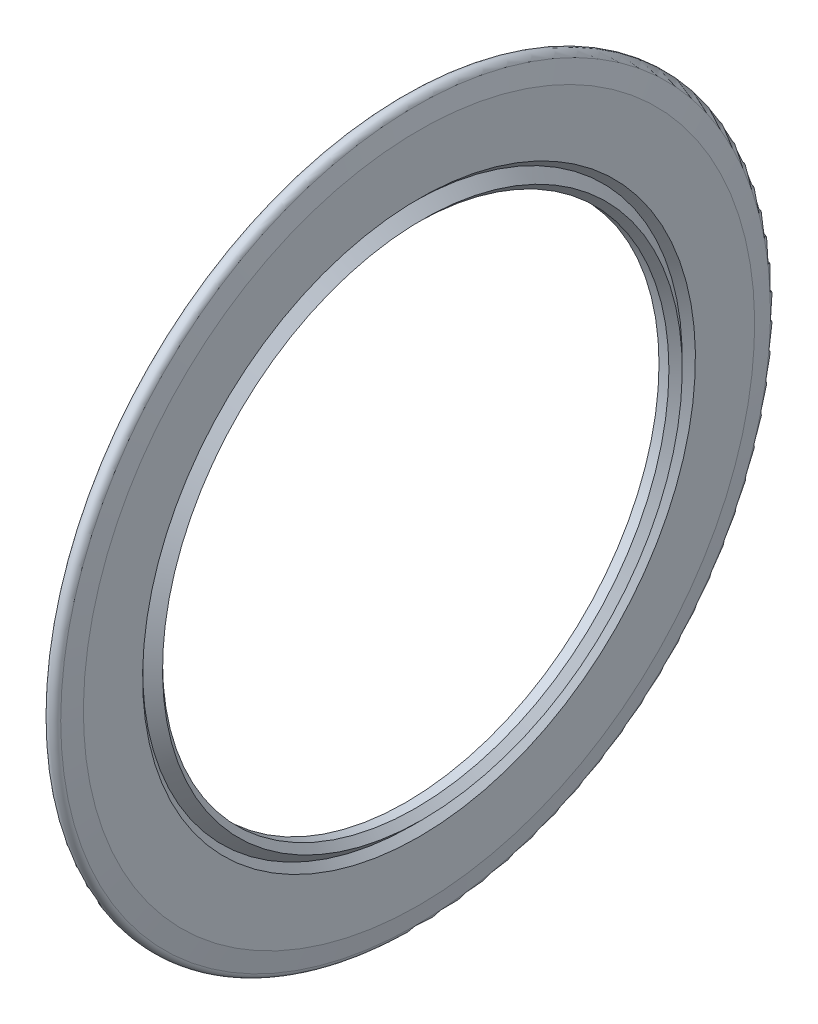
ISO-10303-21;
HEADER;
FILE_DESCRIPTION(('STEP AP214'),'2;1');
FILE_NAME('part.step','',(''),(''),'','','');
FILE_SCHEMA(('AUTOMOTIVE_DESIGN { 1 0 10303 214 1 1 1 1 }'));
ENDSEC;
DATA;
#1=APPLICATION_CONTEXT('core data for automotive mechanical design processes');
#2=APPLICATION_PROTOCOL_DEFINITION('international standard','automotive_design',2000,#1);
#3=PRODUCT_CONTEXT('',#1,'mechanical');
#4=PRODUCT('Part','Part','',(#3));
#5=PRODUCT_RELATED_PRODUCT_CATEGORY('part','',(#4));
#6=PRODUCT_DEFINITION_FORMATION('','',#4);
#7=PRODUCT_DEFINITION_CONTEXT('part definition',#1,'design');
#8=PRODUCT_DEFINITION('design','',#6,#7);
#9=PRODUCT_DEFINITION_SHAPE('','',#8);
#10=(LENGTH_UNIT() NAMED_UNIT(*) SI_UNIT(.MILLI.,.METRE.));
#11=(NAMED_UNIT(*) PLANE_ANGLE_UNIT() SI_UNIT($,.RADIAN.));
#12=(NAMED_UNIT(*) SI_UNIT($,.STERADIAN.) SOLID_ANGLE_UNIT());
#13=UNCERTAINTY_MEASURE_WITH_UNIT(LENGTH_MEASURE(1.E-05),#10,'distance_accuracy_value','');
#14=(GEOMETRIC_REPRESENTATION_CONTEXT(3) GLOBAL_UNCERTAINTY_ASSIGNED_CONTEXT((#13)) GLOBAL_UNIT_ASSIGNED_CONTEXT((#10,
#11,#12)) REPRESENTATION_CONTEXT('',''));
#15=CARTESIAN_POINT('',(0.,0.,0.));
#16=DIRECTION('',(0.,0.,1.));
#17=DIRECTION('',(1.,0.,0.));
#18=AXIS2_PLACEMENT_3D('',#15,#16,#17);
#19=CARTESIAN_POINT('',(0.405,42.41255,0.));
#20=DIRECTION('',(-1.,0.,0.));
#21=DIRECTION('',(0.,0.,1.));
#22=AXIS2_PLACEMENT_3D('',#19,#20,#21);
#23=PLANE('',#22);
#24=CARTESIAN_POINT('',(0.405,0.,0.));
#25=DIRECTION('',(1.,0.,0.));
#26=DIRECTION('',(0.,1.,0.));
#27=AXIS2_PLACEMENT_3D('',#24,#25,#26);
#28=CIRCLE('',#27,41.43175);
#29=CARTESIAN_POINT('',(0.405,-41.43175,0.));
#30=VERTEX_POINT('',#29);
#31=EDGE_CURVE('E11',#30,#30,#28,.T.);
#32=ORIENTED_EDGE('',*,*,#31,.T.);
#33=EDGE_LOOP('',(#32));
#34=FACE_BOUND('',#33,.T.);
#35=CARTESIAN_POINT('',(0.405,0.,0.));
#36=DIRECTION('',(1.,0.,0.));
#37=DIRECTION('',(0.,1.,0.));
#38=AXIS2_PLACEMENT_3D('',#35,#36,#37);
#39=CIRCLE('',#38,43.39335);
#40=CARTESIAN_POINT('',(0.405,0.,43.39335));
#41=VERTEX_POINT('',#40);
#42=EDGE_CURVE('E115',#41,#41,#39,.T.);
#43=ORIENTED_EDGE('',*,*,#42,.F.);
#44=EDGE_LOOP('',(#43));
#45=FACE_BOUND('',#44,.T.);
#46=ADVANCED_FACE('F17',(#34,#45),#23,.T.);
#47=CARTESIAN_POINT('',(0.6075,0.,0.));
#48=DIRECTION('',(-1.,0.,0.));
#49=DIRECTION('',(0.,1.,0.));
#50=AXIS2_PLACEMENT_3D('',#47,#48,#49);
#51=CONICAL_SURFACE('',#50,41.22925,0.78539816339745);
#52=CARTESIAN_POINT('',(0.81,0.,0.));
#53=DIRECTION('',(1.,0.,0.));
#54=DIRECTION('',(0.,1.,0.));
#55=AXIS2_PLACEMENT_3D('',#52,#53,#54);
#56=CIRCLE('',#55,41.02675);
#57=CARTESIAN_POINT('',(0.81,-41.02675,0.));
#58=VERTEX_POINT('',#57);
#59=EDGE_CURVE('E147',#58,#58,#56,.T.);
#60=ORIENTED_EDGE('',*,*,#59,.T.);
#61=DIRECTION('',(-0.707106781186546,-0.707106781186549,0.));
#62=VECTOR('',#61,1.);
#63=CARTESIAN_POINT('',(0.6075,-41.22925,0.));
#64=LINE('',#63,#62);
#65=EDGE_CURVE('E28',#58,#30,#64,.T.);
#66=ORIENTED_EDGE('',*,*,#65,.T.);
#67=ORIENTED_EDGE('',*,*,#31,.F.);
#68=ORIENTED_EDGE('',*,*,#65,.F.);
#69=EDGE_LOOP('',(#60,#66,#67,#68));
#70=FACE_BOUND('',#69,.T.);
#71=ADVANCED_FACE('F176',(#70),#51,.F.);
#72=CARTESIAN_POINT('',(0.81,37.75375,0.));
#73=DIRECTION('',(-1.,0.,0.));
#74=DIRECTION('',(0.,0.,1.));
#75=AXIS2_PLACEMENT_3D('',#72,#73,#74);
#76=PLANE('',#75);
#77=CARTESIAN_POINT('',(0.81,0.,0.));
#78=DIRECTION('',(1.,0.,0.));
#79=DIRECTION('',(0.,1.,0.));
#80=AXIS2_PLACEMENT_3D('',#77,#78,#79);
#81=CIRCLE('',#80,34.48075);
#82=CARTESIAN_POINT('',(0.81,-34.48075,0.));
#83=VERTEX_POINT('',#82);
#84=EDGE_CURVE('E138',#83,#83,#81,.T.);
#85=ORIENTED_EDGE('',*,*,#84,.T.);
#86=EDGE_LOOP('',(#85));
#87=FACE_BOUND('',#86,.T.);
#88=ORIENTED_EDGE('',*,*,#59,.F.);
#89=EDGE_LOOP('',(#88));
#90=FACE_BOUND('',#89,.T.);
#91=ADVANCED_FACE('F178',(#87,#90),#76,.T.);
#92=CARTESIAN_POINT('',(0.6075,0.,0.));
#93=DIRECTION('',(1.,0.,0.));
#94=DIRECTION('',(0.,1.,0.));
#95=AXIS2_PLACEMENT_3D('',#92,#93,#94);
#96=CONICAL_SURFACE('',#95,34.27825,0.785398163397441);
#97=ORIENTED_EDGE('',*,*,#84,.F.);
#98=DIRECTION('',(-0.707106781186553,0.707106781186543,0.));
#99=VECTOR('',#98,1.);
#100=CARTESIAN_POINT('',(0.6075,-34.27825,0.));
#101=LINE('',#100,#99);
#102=CARTESIAN_POINT('',(0.405,-34.07575,0.));
#103=VERTEX_POINT('',#102);
#104=EDGE_CURVE('E142',#83,#103,#101,.T.);
#105=ORIENTED_EDGE('',*,*,#104,.T.);
#106=CARTESIAN_POINT('',(0.405,0.,0.));
#107=DIRECTION('',(1.,0.,0.));
#108=DIRECTION('',(0.,1.,0.));
#109=AXIS2_PLACEMENT_3D('',#106,#107,#108);
#110=CIRCLE('',#109,34.07575);
#111=EDGE_CURVE('E143',#103,#103,#110,.T.);
#112=ORIENTED_EDGE('',*,*,#111,.T.);
#113=ORIENTED_EDGE('',*,*,#104,.F.);
#114=EDGE_LOOP('',(#97,#105,#112,#113));
#115=FACE_BOUND('',#114,.T.);
#116=ADVANCED_FACE('F186',(#115),#96,.T.);
#117=CARTESIAN_POINT('',(0.405,33.58535,0.));
#118=DIRECTION('',(-1.,0.,0.));
#119=DIRECTION('',(0.,0.,1.));
#120=AXIS2_PLACEMENT_3D('',#117,#118,#119);
#121=PLANE('',#120);
#122=CARTESIAN_POINT('',(0.405,0.,0.));
#123=DIRECTION('',(1.,0.,0.));
#124=DIRECTION('',(0.,1.,0.));
#125=AXIS2_PLACEMENT_3D('',#122,#123,#124);
#126=CIRCLE('',#125,33.09495);
#127=CARTESIAN_POINT('',(0.405,-33.09495,0.));
#128=VERTEX_POINT('',#127);
#129=EDGE_CURVE('E104',#128,#128,#126,.T.);
#130=ORIENTED_EDGE('',*,*,#129,.T.);
#131=EDGE_LOOP('',(#130));
#132=FACE_BOUND('',#131,.T.);
#133=ORIENTED_EDGE('',*,*,#111,.F.);
#134=EDGE_LOOP('',(#133));
#135=FACE_BOUND('',#134,.T.);
#136=ADVANCED_FACE('F193',(#132,#135),#121,.T.);
#137=CARTESIAN_POINT('',(1.01526,0.,0.));
#138=DIRECTION('',(-1.,0.,0.));
#139=DIRECTION('',(0.,1.,0.));
#140=AXIS2_PLACEMENT_3D('',#137,#138,#139);
#141=CONICAL_SURFACE('',#140,32.48469,0.785398163397449);
#142=CARTESIAN_POINT('',(1.62552,0.,0.));
#143=DIRECTION('',(1.,0.,0.));
#144=DIRECTION('',(0.,1.,0.));
#145=AXIS2_PLACEMENT_3D('',#142,#143,#144);
#146=CIRCLE('',#145,31.87443);
#147=CARTESIAN_POINT('',(1.62552,-31.87443,0.));
#148=VERTEX_POINT('',#147);
#149=EDGE_CURVE('E94',#148,#148,#146,.T.);
#150=ORIENTED_EDGE('',*,*,#149,.T.);
#151=DIRECTION('',(-0.707106781186547,-0.707106781186548,0.));
#152=VECTOR('',#151,1.);
#153=CARTESIAN_POINT('',(1.01526,-32.48469,0.));
#154=LINE('',#153,#152);
#155=EDGE_CURVE('E96',#148,#128,#154,.T.);
#156=ORIENTED_EDGE('',*,*,#155,.T.);
#157=ORIENTED_EDGE('',*,*,#129,.F.);
#158=ORIENTED_EDGE('',*,*,#155,.F.);
#159=EDGE_LOOP('',(#150,#156,#157,#158));
#160=FACE_BOUND('',#159,.T.);
#161=ADVANCED_FACE('F190',(#160),#141,.F.);
#162=CARTESIAN_POINT('',(1.21776,0.,0.));
#163=DIRECTION('',(1.,0.,0.));
#164=DIRECTION('',(0.,1.,0.));
#165=AXIS2_PLACEMENT_3D('',#162,#163,#164);
#166=CONICAL_SURFACE('',#165,31.46667,0.785398163397446);
#167=ORIENTED_EDGE('',*,*,#149,.F.);
#168=DIRECTION('',(-0.707106781186549,0.707106781186546,0.));
#169=VECTOR('',#168,1.);
#170=CARTESIAN_POINT('',(1.21776,-31.46667,0.));
#171=LINE('',#170,#169);
#172=CARTESIAN_POINT('',(0.81,-31.05891,0.));
#173=VERTEX_POINT('',#172);
#174=EDGE_CURVE('E90',#148,#173,#171,.T.);
#175=ORIENTED_EDGE('',*,*,#174,.T.);
#176=CARTESIAN_POINT('',(0.81,0.,0.));
#177=DIRECTION('',(1.,0.,0.));
#178=DIRECTION('',(0.,1.,0.));
#179=AXIS2_PLACEMENT_3D('',#176,#177,#178);
#180=CIRCLE('',#179,31.05891);
#181=EDGE_CURVE('E92',#173,#173,#180,.T.);
#182=ORIENTED_EDGE('',*,*,#181,.T.);
#183=ORIENTED_EDGE('',*,*,#174,.F.);
#184=EDGE_LOOP('',(#167,#175,#182,#183));
#185=FACE_BOUND('',#184,.T.);
#186=ADVANCED_FACE('F19',(#185),#166,.T.);
#187=CARTESIAN_POINT('',(1.4175,0.,0.));
#188=DIRECTION('',(1.,0.,0.));
#189=DIRECTION('',(0.,1.,0.));
#190=AXIS2_PLACEMENT_3D('',#187,#188,#189);
#191=CYLINDRICAL_SURFACE('',#190,31.05891);
#192=CARTESIAN_POINT('',(2.025,0.,0.));
#193=DIRECTION('',(1.,0.,0.));
#194=DIRECTION('',(0.,1.,0.));
#195=AXIS2_PLACEMENT_3D('',#192,#193,#194);
#196=CIRCLE('',#195,31.05891);
#197=CARTESIAN_POINT('',(2.025,-31.05891,0.));
#198=VERTEX_POINT('',#197);
#199=EDGE_CURVE('E109',#198,#198,#196,.T.);
#200=ORIENTED_EDGE('',*,*,#199,.T.);
#201=DIRECTION('',(-1.,0.,0.));
#202=VECTOR('',#201,1.);
#203=CARTESIAN_POINT('',(1.4175,-31.05891,0.));
#204=LINE('',#203,#202);
#205=EDGE_CURVE('E113',#198,#173,#204,.T.);
#206=ORIENTED_EDGE('',*,*,#205,.T.);
#207=ORIENTED_EDGE('',*,*,#181,.F.);
#208=ORIENTED_EDGE('',*,*,#205,.F.);
#209=EDGE_LOOP('',(#200,#206,#207,#208));
#210=FACE_BOUND('',#209,.T.);
#211=ADVANCED_FACE('F211',(#210),#191,.F.);
#212=CARTESIAN_POINT('',(2.43276,0.,0.));
#213=DIRECTION('',(1.,0.,0.));
#214=DIRECTION('',(0.,1.,0.));
#215=AXIS2_PLACEMENT_3D('',#212,#213,#214);
#216=CONICAL_SURFACE('',#215,31.46667,0.785398163397446);
#217=CARTESIAN_POINT('',(2.84052,0.,0.));
#218=DIRECTION('',(1.,0.,0.));
#219=DIRECTION('',(0.,1.,0.));
#220=AXIS2_PLACEMENT_3D('',#217,#218,#219);
#221=CIRCLE('',#220,31.87443);
#222=CARTESIAN_POINT('',(2.84052,-31.87443,0.));
#223=VERTEX_POINT('',#222);
#224=EDGE_CURVE('E129',#223,#223,#221,.T.);
#225=ORIENTED_EDGE('',*,*,#224,.T.);
#226=DIRECTION('',(-0.707106781186549,0.707106781186546,0.));
#227=VECTOR('',#226,1.);
#228=CARTESIAN_POINT('',(2.43276,-31.46667,0.));
#229=LINE('',#228,#227);
#230=EDGE_CURVE('E114',#223,#198,#229,.T.);
#231=ORIENTED_EDGE('',*,*,#230,.T.);
#232=ORIENTED_EDGE('',*,*,#199,.F.);
#233=ORIENTED_EDGE('',*,*,#230,.F.);
#234=EDGE_LOOP('',(#225,#231,#232,#233));
#235=FACE_BOUND('',#234,.T.);
#236=ADVANCED_FACE('F214',(#235),#216,.F.);
#237=CARTESIAN_POINT('',(2.23026,0.,0.));
#238=DIRECTION('',(-1.,0.,0.));
#239=DIRECTION('',(0.,1.,0.));
#240=AXIS2_PLACEMENT_3D('',#237,#238,#239);
#241=CONICAL_SURFACE('',#240,32.48469,0.785398163397452);
#242=ORIENTED_EDGE('',*,*,#224,.F.);
#243=DIRECTION('',(-0.707106781186545,-0.70710678118655,0.));
#244=VECTOR('',#243,1.);
#245=CARTESIAN_POINT('',(2.23026,-32.48469,0.));
#246=LINE('',#245,#244);
#247=CARTESIAN_POINT('',(1.62,-33.09495,0.));
#248=VERTEX_POINT('',#247);
#249=EDGE_CURVE('E134',#223,#248,#246,.T.);
#250=ORIENTED_EDGE('',*,*,#249,.T.);
#251=CARTESIAN_POINT('',(1.62,0.,0.));
#252=DIRECTION('',(1.,0.,0.));
#253=DIRECTION('',(0.,1.,0.));
#254=AXIS2_PLACEMENT_3D('',#251,#252,#253);
#255=CIRCLE('',#254,33.09495);
#256=EDGE_CURVE('E125',#248,#248,#255,.T.);
#257=ORIENTED_EDGE('',*,*,#256,.T.);
#258=ORIENTED_EDGE('',*,*,#249,.F.);
#259=EDGE_LOOP('',(#242,#250,#257,#258));
#260=FACE_BOUND('',#259,.T.);
#261=ADVANCED_FACE('F218',(#260),#241,.T.);
#262=CARTESIAN_POINT('',(2.025,0.,0.));
#263=DIRECTION('',(1.,0.,0.));
#264=DIRECTION('',(0.,1.,0.));
#265=AXIS2_PLACEMENT_3D('',#262,#263,#264);
#266=CONICAL_SURFACE('',#265,33.49995,0.785398163397446);
#267=CARTESIAN_POINT('',(2.43,0.,0.));
#268=DIRECTION('',(1.,0.,0.));
#269=DIRECTION('',(0.,1.,0.));
#270=AXIS2_PLACEMENT_3D('',#267,#268,#269);
#271=CIRCLE('',#270,33.90495);
#272=CARTESIAN_POINT('',(2.43,-33.90495,0.));
#273=VERTEX_POINT('',#272);
#274=EDGE_CURVE('E159',#273,#273,#271,.T.);
#275=ORIENTED_EDGE('',*,*,#274,.T.);
#276=DIRECTION('',(-0.707106781186549,0.707106781186546,0.));
#277=VECTOR('',#276,1.);
#278=CARTESIAN_POINT('',(2.025,-33.49995,0.));
#279=LINE('',#278,#277);
#280=EDGE_CURVE('E130',#273,#248,#279,.T.);
#281=ORIENTED_EDGE('',*,*,#280,.T.);
#282=ORIENTED_EDGE('',*,*,#256,.F.);
#283=ORIENTED_EDGE('',*,*,#280,.F.);
#284=EDGE_LOOP('',(#275,#281,#282,#283));
#285=FACE_BOUND('',#284,.T.);
#286=ADVANCED_FACE('F203',(#285),#266,.F.);
#287=CARTESIAN_POINT('',(2.43,37.5361483402554,0.));
#288=DIRECTION('',(1.,0.,0.));
#289=DIRECTION('',(0.,1.,0.));
#290=AXIS2_PLACEMENT_3D('',#287,#288,#289);
#291=PLANE('',#290);
#292=ORIENTED_EDGE('',*,*,#274,.F.);
#293=EDGE_LOOP('',(#292));
#294=FACE_BOUND('',#293,.T.);
#295=CARTESIAN_POINT('',(2.43,0.,0.));
#296=DIRECTION('',(1.,0.,0.));
#297=DIRECTION('',(0.,1.,0.));
#298=AXIS2_PLACEMENT_3D('',#295,#296,#297);
#299=CIRCLE('',#298,41.1673466805108);
#300=CARTESIAN_POINT('',(2.43,-41.1673466805108,0.));
#301=VERTEX_POINT('',#300);
#302=EDGE_CURVE('E118',#301,#301,#299,.T.);
#303=ORIENTED_EDGE('',*,*,#302,.T.);
#304=EDGE_LOOP('',(#303));
#305=FACE_BOUND('',#304,.T.);
#306=ADVANCED_FACE('F200',(#294,#305),#291,.T.);
#307=CARTESIAN_POINT('',(2.22134713996994,0.,0.));
#308=DIRECTION('',(-1.,0.,0.));
#309=DIRECTION('',(0.,1.,0.));
#310=AXIS2_PLACEMENT_3D('',#307,#308,#309);
#311=CONICAL_SURFACE('',#310,42.3506758522105,1.39626340159546);
#312=ORIENTED_EDGE('',*,*,#302,.F.);
#313=DIRECTION('',(-0.173648177666931,-0.984807753012208,0.));
#314=VECTOR('',#313,1.);
#315=CARTESIAN_POINT('',(2.22134713996994,-42.3506758522105,0.));
#316=LINE('',#315,#314);
#317=CARTESIAN_POINT('',(2.01269427993988,-43.5340050239102,0.));
#318=VERTEX_POINT('',#317);
#319=EDGE_CURVE('E21',#301,#318,#316,.T.);
#320=ORIENTED_EDGE('',*,*,#319,.T.);
#321=CARTESIAN_POINT('',(2.01269427993989,0.,0.));
#322=DIRECTION('',(1.,0.,0.));
#323=DIRECTION('',(0.,1.,0.));
#324=AXIS2_PLACEMENT_3D('',#321,#322,#323);
#325=CIRCLE('',#324,43.5340050239102);
#326=CARTESIAN_POINT('',(2.01269427993989,0.,43.5340050239102));
#327=VERTEX_POINT('',#326);
#328=EDGE_CURVE('E124',#318,#327,#325,.T.);
#329=ORIENTED_EDGE('',*,*,#328,.T.);
#330=CARTESIAN_POINT('',(2.01269427993989,0.,0.));
#331=DIRECTION('',(1.,0.,0.));
#332=DIRECTION('',(0.,1.,0.));
#333=AXIS2_PLACEMENT_3D('',#330,#331,#332);
#334=CIRCLE('',#333,43.5340050239102);
#335=EDGE_CURVE('E120',#327,#318,#334,.T.);
#336=ORIENTED_EDGE('',*,*,#335,.T.);
#337=ORIENTED_EDGE('',*,*,#319,.F.);
#338=EDGE_LOOP('',(#312,#320,#329,#336,#337));
#339=FACE_BOUND('',#338,.T.);
#340=ADVANCED_FACE('F198',(#339),#311,.T.);
#341=CARTESIAN_POINT('',(1.215,0.,0.));
#342=DIRECTION('',(1.,0.,0.));
#343=DIRECTION('',(0.,0.,-1.));
#344=AXIS2_PLACEMENT_3D('',#341,#342,#343);
#345=TOROIDAL_SURFACE('',#344,43.39335,0.81);
#346=ORIENTED_EDGE('',*,*,#328,.F.);
#347=ORIENTED_EDGE('',*,*,#335,.F.);
#348=CARTESIAN_POINT('',(1.215,0.,43.39335));
#349=DIRECTION('',(0.,-1.,0.));
#350=DIRECTION('',(0.,0.,1.));
#351=AXIS2_PLACEMENT_3D('',#348,#349,#350);
#352=CIRCLE('',#351,0.81);
#353=EDGE_CURVE('E119',#327,#41,#352,.T.);
#354=ORIENTED_EDGE('',*,*,#353,.T.);
#355=ORIENTED_EDGE('',*,*,#42,.T.);
#356=ORIENTED_EDGE('',*,*,#353,.F.);
#357=EDGE_LOOP('',(#346,#347,#354,#355,#356));
#358=FACE_BOUND('',#357,.T.);
#359=ADVANCED_FACE('F195',(#358),#345,.T.);
#360=CLOSED_SHELL('',(#46,#71,#91,#116,#136,#161,#186,#211,#236,#261,#286,#306,#340,#359));
#361=MANIFOLD_SOLID_BREP('B1',#360);
#362=ADVANCED_BREP_SHAPE_REPRESENTATION('',(#18,#361),#14);
#363=SHAPE_DEFINITION_REPRESENTATION(#9,#362);
ENDSEC;
END-ISO-10303-21;
